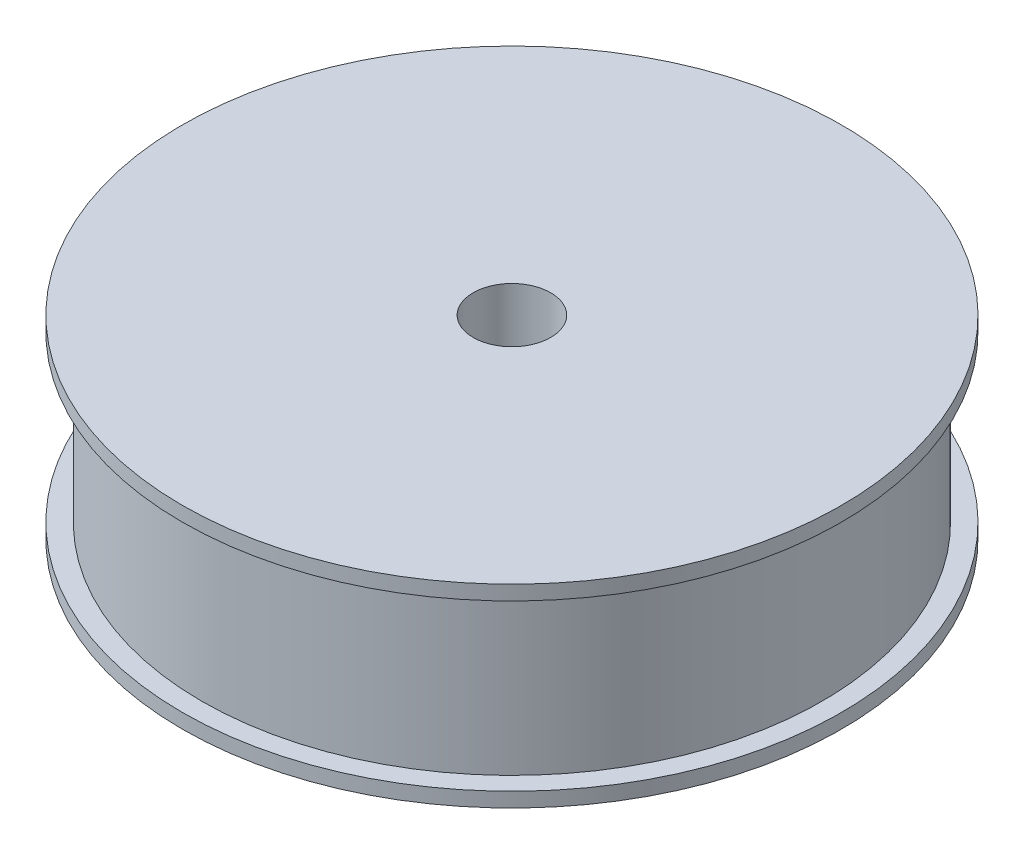
ISO-10303-21;
HEADER;
FILE_DESCRIPTION(('STEP AP214'),'2;1');
FILE_NAME('part.step','',(''),(''),'','','');
FILE_SCHEMA(('AUTOMOTIVE_DESIGN { 1 0 10303 214 1 1 1 1 }'));
ENDSEC;
DATA;
#1=APPLICATION_CONTEXT('core data for automotive mechanical design processes');
#2=APPLICATION_PROTOCOL_DEFINITION('international standard','automotive_design',2000,#1);
#3=PRODUCT_CONTEXT('',#1,'mechanical');
#4=PRODUCT('Part','Part','',(#3));
#5=PRODUCT_RELATED_PRODUCT_CATEGORY('part','',(#4));
#6=PRODUCT_DEFINITION_FORMATION('','',#4);
#7=PRODUCT_DEFINITION_CONTEXT('part definition',#1,'design');
#8=PRODUCT_DEFINITION('design','',#6,#7);
#9=PRODUCT_DEFINITION_SHAPE('','',#8);
#10=(LENGTH_UNIT() NAMED_UNIT(*) SI_UNIT(.MILLI.,.METRE.));
#11=(NAMED_UNIT(*) PLANE_ANGLE_UNIT() SI_UNIT($,.RADIAN.));
#12=(NAMED_UNIT(*) SI_UNIT($,.STERADIAN.) SOLID_ANGLE_UNIT());
#13=UNCERTAINTY_MEASURE_WITH_UNIT(LENGTH_MEASURE(1.E-05),#10,'distance_accuracy_value','');
#14=(GEOMETRIC_REPRESENTATION_CONTEXT(3) GLOBAL_UNCERTAINTY_ASSIGNED_CONTEXT((#13)) GLOBAL_UNIT_ASSIGNED_CONTEXT((#10,
#11,#12)) REPRESENTATION_CONTEXT('',''));
#15=CARTESIAN_POINT('',(0.,0.,0.));
#16=DIRECTION('',(0.,0.,1.));
#17=DIRECTION('',(1.,0.,0.));
#18=AXIS2_PLACEMENT_3D('',#15,#16,#17);
#19=CARTESIAN_POINT('',(0.,10.3155225102178,0.));
#20=DIRECTION('',(0.,1.,0.));
#21=DIRECTION('',(0.,0.,1.));
#22=AXIS2_PLACEMENT_3D('',#19,#20,#21);
#23=CYLINDRICAL_SURFACE('',#22,34.);
#24=CARTESIAN_POINT('',(0.,-8.5,0.));
#25=DIRECTION('',(0.,1.,0.));
#26=DIRECTION('',(0.,0.,1.));
#27=AXIS2_PLACEMENT_3D('',#24,#25,#26);
#28=CIRCLE('',#27,34.);
#29=CARTESIAN_POINT('',(0.,-8.5,34.));
#30=VERTEX_POINT('',#29);
#31=EDGE_CURVE('E72',#30,#30,#28,.T.);
#32=ORIENTED_EDGE('',*,*,#31,.F.);
#33=EDGE_LOOP('',(#32));
#34=FACE_BOUND('',#33,.T.);
#35=CARTESIAN_POINT('',(0.,-10.,0.));
#36=DIRECTION('',(0.,1.,0.));
#37=DIRECTION('',(0.,0.,1.));
#38=AXIS2_PLACEMENT_3D('',#35,#36,#37);
#39=CIRCLE('',#38,34.);
#40=CARTESIAN_POINT('',(0.,-10.,34.));
#41=VERTEX_POINT('',#40);
#42=EDGE_CURVE('E10',#41,#41,#39,.T.);
#43=ORIENTED_EDGE('',*,*,#42,.T.);
#44=EDGE_LOOP('',(#43));
#45=FACE_BOUND('',#44,.T.);
#46=ADVANCED_FACE('F37',(#34,#45),#23,.T.);
#47=CARTESIAN_POINT('',(0.,-10.,-34.));
#48=DIRECTION('',(0.,1.,0.));
#49=DIRECTION('',(0.,0.,1.));
#50=AXIS2_PLACEMENT_3D('',#47,#48,#49);
#51=PLANE('',#50);
#52=ORIENTED_EDGE('',*,*,#42,.F.);
#53=EDGE_LOOP('',(#52));
#54=FACE_BOUND('',#53,.T.);
#55=CARTESIAN_POINT('',(0.,-10.,0.));
#56=DIRECTION('',(0.,1.,0.));
#57=DIRECTION('',(0.,0.,1.));
#58=AXIS2_PLACEMENT_3D('',#55,#56,#57);
#59=CIRCLE('',#58,4.);
#60=CARTESIAN_POINT('',(0.,-10.,4.));
#61=VERTEX_POINT('',#60);
#62=EDGE_CURVE('E44',#61,#61,#59,.T.);
#63=ORIENTED_EDGE('',*,*,#62,.T.);
#64=EDGE_LOOP('',(#63));
#65=FACE_BOUND('',#64,.T.);
#66=ADVANCED_FACE('F80',(#54,#65),#51,.F.);
#67=CARTESIAN_POINT('',(0.,10.3155225102178,0.));
#68=DIRECTION('',(0.,1.,0.));
#69=DIRECTION('',(0.,0.,1.));
#70=AXIS2_PLACEMENT_3D('',#67,#68,#69);
#71=CYLINDRICAL_SURFACE('',#70,4.);
#72=ORIENTED_EDGE('',*,*,#62,.F.);
#73=EDGE_LOOP('',(#72));
#74=FACE_BOUND('',#73,.T.);
#75=CARTESIAN_POINT('',(0.,10.,0.));
#76=DIRECTION('',(0.,1.,0.));
#77=DIRECTION('',(0.,0.,1.));
#78=AXIS2_PLACEMENT_3D('',#75,#76,#77);
#79=CIRCLE('',#78,4.);
#80=CARTESIAN_POINT('',(0.,10.,4.));
#81=VERTEX_POINT('',#80);
#82=EDGE_CURVE('E49',#81,#81,#79,.T.);
#83=ORIENTED_EDGE('',*,*,#82,.T.);
#84=EDGE_LOOP('',(#83));
#85=FACE_BOUND('',#84,.T.);
#86=ADVANCED_FACE('F84',(#74,#85),#71,.F.);
#87=CARTESIAN_POINT('',(0.,10.,-34.));
#88=DIRECTION('',(0.,-1.,0.));
#89=DIRECTION('',(0.,0.,-1.));
#90=AXIS2_PLACEMENT_3D('',#87,#88,#89);
#91=PLANE('',#90);
#92=ORIENTED_EDGE('',*,*,#82,.F.);
#93=EDGE_LOOP('',(#92));
#94=FACE_BOUND('',#93,.T.);
#95=CARTESIAN_POINT('',(0.,10.,0.));
#96=DIRECTION('',(0.,1.,0.));
#97=DIRECTION('',(0.,0.,1.));
#98=AXIS2_PLACEMENT_3D('',#95,#96,#97);
#99=CIRCLE('',#98,34.);
#100=CARTESIAN_POINT('',(0.,10.,34.));
#101=VERTEX_POINT('',#100);
#102=EDGE_CURVE('E54',#101,#101,#99,.T.);
#103=ORIENTED_EDGE('',*,*,#102,.T.);
#104=EDGE_LOOP('',(#103));
#105=FACE_BOUND('',#104,.T.);
#106=ADVANCED_FACE('F89',(#94,#105),#91,.F.);
#107=CARTESIAN_POINT('',(0.,10.3155225102178,0.));
#108=DIRECTION('',(0.,1.,0.));
#109=DIRECTION('',(0.,0.,1.));
#110=AXIS2_PLACEMENT_3D('',#107,#108,#109);
#111=CYLINDRICAL_SURFACE('',#110,34.);
#112=ORIENTED_EDGE('',*,*,#102,.F.);
#113=EDGE_LOOP('',(#112));
#114=FACE_BOUND('',#113,.T.);
#115=CARTESIAN_POINT('',(0.,8.5,0.));
#116=DIRECTION('',(0.,1.,0.));
#117=DIRECTION('',(0.,0.,1.));
#118=AXIS2_PLACEMENT_3D('',#115,#116,#117);
#119=CIRCLE('',#118,34.);
#120=CARTESIAN_POINT('',(0.,8.5,34.));
#121=VERTEX_POINT('',#120);
#122=EDGE_CURVE('E60',#121,#121,#119,.T.);
#123=ORIENTED_EDGE('',*,*,#122,.T.);
#124=EDGE_LOOP('',(#123));
#125=FACE_BOUND('',#124,.T.);
#126=ADVANCED_FACE('F95',(#114,#125),#111,.T.);
#127=CARTESIAN_POINT('',(0.,8.5,-32.));
#128=DIRECTION('',(0.,1.,0.));
#129=DIRECTION('',(0.,0.,1.));
#130=AXIS2_PLACEMENT_3D('',#127,#128,#129);
#131=PLANE('',#130);
#132=ORIENTED_EDGE('',*,*,#122,.F.);
#133=EDGE_LOOP('',(#132));
#134=FACE_BOUND('',#133,.T.);
#135=CARTESIAN_POINT('',(0.,8.5,0.));
#136=DIRECTION('',(0.,1.,0.));
#137=DIRECTION('',(0.,0.,1.));
#138=AXIS2_PLACEMENT_3D('',#135,#136,#137);
#139=CIRCLE('',#138,32.);
#140=CARTESIAN_POINT('',(0.,8.5,32.));
#141=VERTEX_POINT('',#140);
#142=EDGE_CURVE('E64',#141,#141,#139,.T.);
#143=ORIENTED_EDGE('',*,*,#142,.T.);
#144=EDGE_LOOP('',(#143));
#145=FACE_BOUND('',#144,.T.);
#146=ADVANCED_FACE('F99',(#134,#145),#131,.F.);
#147=CARTESIAN_POINT('',(0.,10.3155225102178,0.));
#148=DIRECTION('',(0.,1.,0.));
#149=DIRECTION('',(0.,0.,1.));
#150=AXIS2_PLACEMENT_3D('',#147,#148,#149);
#151=CYLINDRICAL_SURFACE('',#150,32.);
#152=ORIENTED_EDGE('',*,*,#142,.F.);
#153=EDGE_LOOP('',(#152));
#154=FACE_BOUND('',#153,.T.);
#155=CARTESIAN_POINT('',(0.,-8.5,0.));
#156=DIRECTION('',(0.,1.,0.));
#157=DIRECTION('',(0.,0.,1.));
#158=AXIS2_PLACEMENT_3D('',#155,#156,#157);
#159=CIRCLE('',#158,32.);
#160=CARTESIAN_POINT('',(0.,-8.5,32.));
#161=VERTEX_POINT('',#160);
#162=EDGE_CURVE('E68',#161,#161,#159,.T.);
#163=ORIENTED_EDGE('',*,*,#162,.T.);
#164=EDGE_LOOP('',(#163));
#165=FACE_BOUND('',#164,.T.);
#166=ADVANCED_FACE('F103',(#154,#165),#151,.T.);
#167=CARTESIAN_POINT('',(0.,-8.5,-32.));
#168=DIRECTION('',(0.,-1.,0.));
#169=DIRECTION('',(0.,0.,-1.));
#170=AXIS2_PLACEMENT_3D('',#167,#168,#169);
#171=PLANE('',#170);
#172=ORIENTED_EDGE('',*,*,#162,.F.);
#173=EDGE_LOOP('',(#172));
#174=FACE_BOUND('',#173,.T.);
#175=ORIENTED_EDGE('',*,*,#31,.T.);
#176=EDGE_LOOP('',(#175));
#177=FACE_BOUND('',#176,.T.);
#178=ADVANCED_FACE('F77',(#174,#177),#171,.F.);
#179=CLOSED_SHELL('',(#46,#66,#86,#106,#126,#146,#166,#178));
#180=MANIFOLD_SOLID_BREP('B2',#179);
#181=ADVANCED_BREP_SHAPE_REPRESENTATION('',(#18,#180),#14);
#182=SHAPE_DEFINITION_REPRESENTATION(#9,#181);
ENDSEC;
END-ISO-10303-21;
